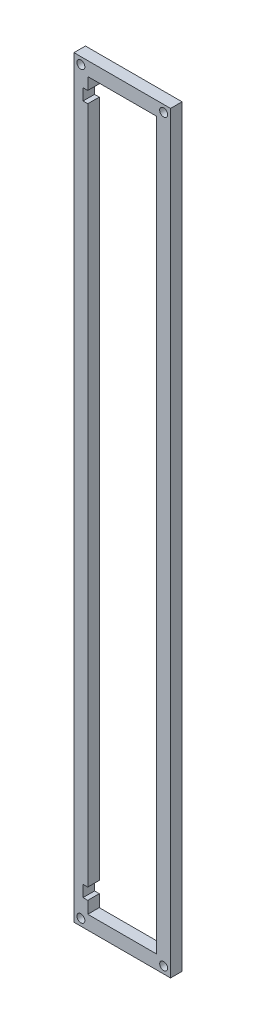
ISO-10303-21;
HEADER;
FILE_DESCRIPTION(('STEP AP214'),'2;1');
FILE_NAME('part.step','',(''),(''),'','','');
FILE_SCHEMA(('AUTOMOTIVE_DESIGN { 1 0 10303 214 1 1 1 1 }'));
ENDSEC;
DATA;
#1=APPLICATION_CONTEXT('core data for automotive mechanical design processes');
#2=APPLICATION_PROTOCOL_DEFINITION('international standard','automotive_design',2000,#1);
#3=PRODUCT_CONTEXT('',#1,'mechanical');
#4=PRODUCT('Part','Part','',(#3));
#5=PRODUCT_RELATED_PRODUCT_CATEGORY('part','',(#4));
#6=PRODUCT_DEFINITION_FORMATION('','',#4);
#7=PRODUCT_DEFINITION_CONTEXT('part definition',#1,'design');
#8=PRODUCT_DEFINITION('design','',#6,#7);
#9=PRODUCT_DEFINITION_SHAPE('','',#8);
#10=(LENGTH_UNIT() NAMED_UNIT(*) SI_UNIT(.MILLI.,.METRE.));
#11=(NAMED_UNIT(*) PLANE_ANGLE_UNIT() SI_UNIT($,.RADIAN.));
#12=(NAMED_UNIT(*) SI_UNIT($,.STERADIAN.) SOLID_ANGLE_UNIT());
#13=UNCERTAINTY_MEASURE_WITH_UNIT(LENGTH_MEASURE(1.E-05),#10,'distance_accuracy_value','');
#14=(GEOMETRIC_REPRESENTATION_CONTEXT(3) GLOBAL_UNCERTAINTY_ASSIGNED_CONTEXT((#13)) GLOBAL_UNIT_ASSIGNED_CONTEXT((#10,
#11,#12)) REPRESENTATION_CONTEXT('',''));
#15=CARTESIAN_POINT('',(0.,0.,0.));
#16=DIRECTION('',(0.,0.,1.));
#17=DIRECTION('',(1.,0.,0.));
#18=AXIS2_PLACEMENT_3D('',#15,#16,#17);
#19=CARTESIAN_POINT('',(-167.281422107139,404.74408839779,6.35));
#20=DIRECTION('',(-1.,0.,0.));
#21=DIRECTION('',(0.,0.,1.));
#22=AXIS2_PLACEMENT_3D('',#19,#20,#21);
#23=PLANE('',#22);
#24=DIRECTION('',(0.,1.,0.));
#25=VECTOR('',#24,1.);
#26=CARTESIAN_POINT('',(-167.281422107139,404.74408839779,6.35));
#27=LINE('',#26,#25);
#28=CARTESIAN_POINT('',(-167.281422107139,17.0765883977901,6.35));
#29=VERTEX_POINT('',#28);
#30=CARTESIAN_POINT('',(-167.281422107139,391.72658839779,6.35));
#31=VERTEX_POINT('',#30);
#32=EDGE_CURVE('E57',#29,#31,#27,.T.);
#33=ORIENTED_EDGE('',*,*,#32,.F.);
#34=DIRECTION('',(0.,0.,1.));
#35=VECTOR('',#34,1.);
#36=CARTESIAN_POINT('',(-167.281422107139,17.0765883977901,0.));
#37=LINE('',#36,#35);
#38=CARTESIAN_POINT('',(-167.281422107139,17.0765883977901,0.));
#39=VERTEX_POINT('',#38);
#40=EDGE_CURVE('E176',#39,#29,#37,.T.);
#41=ORIENTED_EDGE('',*,*,#40,.F.);
#42=DIRECTION('',(0.,1.,0.));
#43=VECTOR('',#42,1.);
#44=CARTESIAN_POINT('',(-167.281422107139,404.74408839779,0.));
#45=LINE('',#44,#43);
#46=CARTESIAN_POINT('',(-167.281422107139,391.72658839779,0.));
#47=VERTEX_POINT('',#46);
#48=EDGE_CURVE('E251',#39,#47,#45,.T.);
#49=ORIENTED_EDGE('',*,*,#48,.T.);
#50=DIRECTION('',(0.,0.,1.));
#51=VECTOR('',#50,1.);
#52=CARTESIAN_POINT('',(-167.281422107139,391.72658839779,0.));
#53=LINE('',#52,#51);
#54=EDGE_CURVE('E199',#47,#31,#53,.T.);
#55=ORIENTED_EDGE('',*,*,#54,.T.);
#56=EDGE_LOOP('',(#33,#41,#49,#55));
#57=FACE_BOUND('',#56,.T.);
#58=ADVANCED_FACE('F34',(#57),#23,.F.);
#59=CARTESIAN_POINT('',(-167.281422107139,398.07658839779,6.35));
#60=VERTEX_POINT('',#59);
#61=CARTESIAN_POINT('',(-167.281422107139,404.74408839779,6.35));
#62=VERTEX_POINT('',#61);
#63=EDGE_CURVE('E238',#60,#62,#27,.T.);
#64=ORIENTED_EDGE('',*,*,#63,.F.);
#65=DIRECTION('',(0.,0.,1.));
#66=VECTOR('',#65,1.);
#67=CARTESIAN_POINT('',(-167.281422107139,398.07658839779,0.));
#68=LINE('',#67,#66);
#69=CARTESIAN_POINT('',(-167.281422107139,398.07658839779,0.));
#70=VERTEX_POINT('',#69);
#71=EDGE_CURVE('E197',#70,#60,#68,.T.);
#72=ORIENTED_EDGE('',*,*,#71,.F.);
#73=CARTESIAN_POINT('',(-167.281422107139,404.74408839779,0.));
#74=VERTEX_POINT('',#73);
#75=EDGE_CURVE('E233',#70,#74,#45,.T.);
#76=ORIENTED_EDGE('',*,*,#75,.T.);
#77=DIRECTION('',(0.,0.,-1.));
#78=VECTOR('',#77,1.);
#79=CARTESIAN_POINT('',(-167.281422107139,404.74408839779,6.35));
#80=LINE('',#79,#78);
#81=EDGE_CURVE('E247',#62,#74,#80,.T.);
#82=ORIENTED_EDGE('',*,*,#81,.F.);
#83=EDGE_LOOP('',(#64,#72,#76,#82));
#84=FACE_BOUND('',#83,.T.);
#85=ADVANCED_FACE('F317',(#84),#23,.F.);
#86=CARTESIAN_POINT('',(-121.561422107139,412.36408839779,6.35));
#87=DIRECTION('',(-1.,0.,0.));
#88=DIRECTION('',(0.,-1.,0.));
#89=AXIS2_PLACEMENT_3D('',#86,#87,#88);
#90=PLANE('',#89);
#91=DIRECTION('',(0.,1.,0.));
#92=VECTOR('',#91,1.);
#93=CARTESIAN_POINT('',(-121.561422107139,412.36408839779,0.));
#94=LINE('',#93,#92);
#95=CARTESIAN_POINT('',(-121.561422107139,-3.56091160220995,0.));
#96=VERTEX_POINT('',#95);
#97=CARTESIAN_POINT('',(-121.561422107139,412.36408839779,0.));
#98=VERTEX_POINT('',#97);
#99=EDGE_CURVE('E262',#96,#98,#94,.T.);
#100=ORIENTED_EDGE('',*,*,#99,.T.);
#101=DIRECTION('',(0.,0.,-1.));
#102=VECTOR('',#101,1.);
#103=CARTESIAN_POINT('',(-121.561422107139,412.36408839779,6.35));
#104=LINE('',#103,#102);
#105=CARTESIAN_POINT('',(-121.561422107139,412.36408839779,6.35));
#106=VERTEX_POINT('',#105);
#107=EDGE_CURVE('E11',#106,#98,#104,.T.);
#108=ORIENTED_EDGE('',*,*,#107,.F.);
#109=DIRECTION('',(0.,1.,0.));
#110=VECTOR('',#109,1.);
#111=CARTESIAN_POINT('',(-121.561422107139,412.36408839779,6.35));
#112=LINE('',#111,#110);
#113=CARTESIAN_POINT('',(-121.561422107139,-3.56091160220995,6.35));
#114=VERTEX_POINT('',#113);
#115=EDGE_CURVE('E269',#114,#106,#112,.T.);
#116=ORIENTED_EDGE('',*,*,#115,.F.);
#117=DIRECTION('',(0.,0.,-1.));
#118=VECTOR('',#117,1.);
#119=CARTESIAN_POINT('',(-121.561422107139,-3.56091160220995,6.35));
#120=LINE('',#119,#118);
#121=EDGE_CURVE('E279',#114,#96,#120,.T.);
#122=ORIENTED_EDGE('',*,*,#121,.T.);
#123=EDGE_LOOP('',(#100,#108,#116,#122));
#124=FACE_BOUND('',#123,.T.);
#125=ADVANCED_FACE('F36',(#124),#90,.F.);
#126=CARTESIAN_POINT('',(-174.901422107139,412.36408839779,6.35));
#127=DIRECTION('',(0.,-1.,0.));
#128=DIRECTION('',(0.,0.,-1.));
#129=AXIS2_PLACEMENT_3D('',#126,#127,#128);
#130=PLANE('',#129);
#131=DIRECTION('',(-1.,0.,0.));
#132=VECTOR('',#131,1.);
#133=CARTESIAN_POINT('',(-174.901422107139,412.36408839779,0.));
#134=LINE('',#133,#132);
#135=CARTESIAN_POINT('',(-174.901422107139,412.36408839779,0.));
#136=VERTEX_POINT('',#135);
#137=EDGE_CURVE('E282',#98,#136,#134,.T.);
#138=ORIENTED_EDGE('',*,*,#137,.T.);
#139=DIRECTION('',(0.,0.,-1.));
#140=VECTOR('',#139,1.);
#141=CARTESIAN_POINT('',(-174.901422107139,412.36408839779,6.35));
#142=LINE('',#141,#140);
#143=CARTESIAN_POINT('',(-174.901422107139,412.36408839779,6.35));
#144=VERTEX_POINT('',#143);
#145=EDGE_CURVE('E42',#144,#136,#142,.T.);
#146=ORIENTED_EDGE('',*,*,#145,.F.);
#147=DIRECTION('',(-1.,0.,0.));
#148=VECTOR('',#147,1.);
#149=CARTESIAN_POINT('',(-174.901422107139,412.36408839779,6.35));
#150=LINE('',#149,#148);
#151=EDGE_CURVE('E272',#106,#144,#150,.T.);
#152=ORIENTED_EDGE('',*,*,#151,.F.);
#153=ORIENTED_EDGE('',*,*,#107,.T.);
#154=EDGE_LOOP('',(#138,#146,#152,#153));
#155=FACE_BOUND('',#154,.T.);
#156=ADVANCED_FACE('F310',(#155),#130,.F.);
#157=CARTESIAN_POINT('',(-174.901422107139,412.36408839779,6.35));
#158=DIRECTION('',(1.,0.,0.));
#159=DIRECTION('',(0.,1.,0.));
#160=AXIS2_PLACEMENT_3D('',#157,#158,#159);
#161=PLANE('',#160);
#162=DIRECTION('',(0.,-1.,0.));
#163=VECTOR('',#162,1.);
#164=CARTESIAN_POINT('',(-174.901422107139,412.36408839779,0.));
#165=LINE('',#164,#163);
#166=CARTESIAN_POINT('',(-174.901422107139,-3.56091160220995,0.));
#167=VERTEX_POINT('',#166);
#168=EDGE_CURVE('E284',#136,#167,#165,.T.);
#169=ORIENTED_EDGE('',*,*,#168,.T.);
#170=DIRECTION('',(0.,0.,-1.));
#171=VECTOR('',#170,1.);
#172=CARTESIAN_POINT('',(-174.901422107139,-3.56091160220995,6.35));
#173=LINE('',#172,#171);
#174=CARTESIAN_POINT('',(-174.901422107139,-3.56091160220995,6.35));
#175=VERTEX_POINT('',#174);
#176=EDGE_CURVE('E289',#175,#167,#173,.T.);
#177=ORIENTED_EDGE('',*,*,#176,.F.);
#178=DIRECTION('',(0.,-1.,0.));
#179=VECTOR('',#178,1.);
#180=CARTESIAN_POINT('',(-174.901422107139,412.36408839779,6.35));
#181=LINE('',#180,#179);
#182=EDGE_CURVE('E275',#144,#175,#181,.T.);
#183=ORIENTED_EDGE('',*,*,#182,.F.);
#184=ORIENTED_EDGE('',*,*,#145,.T.);
#185=EDGE_LOOP('',(#169,#177,#183,#184));
#186=FACE_BOUND('',#185,.T.);
#187=ADVANCED_FACE('F296',(#186),#161,.F.);
#188=CARTESIAN_POINT('',(-174.901422107139,-3.56091160220995,6.35));
#189=DIRECTION('',(0.,1.,0.));
#190=DIRECTION('',(0.,0.,1.));
#191=AXIS2_PLACEMENT_3D('',#188,#189,#190);
#192=PLANE('',#191);
#193=DIRECTION('',(1.,0.,0.));
#194=VECTOR('',#193,1.);
#195=CARTESIAN_POINT('',(-174.901422107139,-3.56091160220995,0.));
#196=LINE('',#195,#194);
#197=EDGE_CURVE('E273',#167,#96,#196,.T.);
#198=ORIENTED_EDGE('',*,*,#197,.T.);
#199=ORIENTED_EDGE('',*,*,#121,.F.);
#200=DIRECTION('',(1.,0.,0.));
#201=VECTOR('',#200,1.);
#202=CARTESIAN_POINT('',(-174.901422107139,-3.56091160220995,6.35));
#203=LINE('',#202,#201);
#204=EDGE_CURVE('E277',#175,#114,#203,.T.);
#205=ORIENTED_EDGE('',*,*,#204,.F.);
#206=ORIENTED_EDGE('',*,*,#176,.T.);
#207=EDGE_LOOP('',(#198,#199,#205,#206));
#208=FACE_BOUND('',#207,.T.);
#209=ADVANCED_FACE('F303',(#208),#192,.F.);
#210=CARTESIAN_POINT('',(0.,0.,6.35));
#211=DIRECTION('',(0.,0.,1.));
#212=DIRECTION('',(1.,0.,0.));
#213=AXIS2_PLACEMENT_3D('',#210,#211,#212);
#214=PLANE('',#213);
#215=DIRECTION('',(-1.,0.,0.));
#216=VECTOR('',#215,1.);
#217=CARTESIAN_POINT('',(0.,17.0765883977901,6.35));
#218=LINE('',#217,#216);
#219=CARTESIAN_POINT('',(-169.900797107139,17.0765883977901,6.35));
#220=VERTEX_POINT('',#219);
#221=EDGE_CURVE('E180',#29,#220,#218,.T.);
#222=ORIENTED_EDGE('',*,*,#221,.F.);
#223=ORIENTED_EDGE('',*,*,#32,.T.);
#224=DIRECTION('',(1.,0.,0.));
#225=VECTOR('',#224,1.);
#226=CARTESIAN_POINT('',(0.,391.72658839779,6.35));
#227=LINE('',#226,#225);
#228=CARTESIAN_POINT('',(-169.900797107136,391.72658839779,6.35));
#229=VERTEX_POINT('',#228);
#230=EDGE_CURVE('E196',#229,#31,#227,.T.);
#231=ORIENTED_EDGE('',*,*,#230,.F.);
#232=DIRECTION('',(0.,-1.,0.));
#233=VECTOR('',#232,1.);
#234=CARTESIAN_POINT('',(-169.900797107136,0.,6.35));
#235=LINE('',#234,#233);
#236=CARTESIAN_POINT('',(-169.900797107136,398.07658839779,6.35));
#237=VERTEX_POINT('',#236);
#238=EDGE_CURVE('E207',#237,#229,#235,.T.);
#239=ORIENTED_EDGE('',*,*,#238,.F.);
#240=DIRECTION('',(-1.,0.,0.));
#241=VECTOR('',#240,1.);
#242=CARTESIAN_POINT('',(0.,398.07658839779,6.35));
#243=LINE('',#242,#241);
#244=EDGE_CURVE('E205',#60,#237,#243,.T.);
#245=ORIENTED_EDGE('',*,*,#244,.F.);
#246=ORIENTED_EDGE('',*,*,#63,.T.);
#247=DIRECTION('',(1.,0.,0.));
#248=VECTOR('',#247,1.);
#249=CARTESIAN_POINT('',(-129.181422107139,404.74408839779,6.35));
#250=LINE('',#249,#248);
#251=CARTESIAN_POINT('',(-129.181422107139,404.74408839779,6.35));
#252=VERTEX_POINT('',#251);
#253=EDGE_CURVE('E237',#62,#252,#250,.T.);
#254=ORIENTED_EDGE('',*,*,#253,.T.);
#255=DIRECTION('',(0.,-1.,0.));
#256=VECTOR('',#255,1.);
#257=CARTESIAN_POINT('',(-129.181422107139,404.74408839779,6.35));
#258=LINE('',#257,#256);
#259=CARTESIAN_POINT('',(-129.181422107139,4.05908839779005,6.35));
#260=VERTEX_POINT('',#259);
#261=EDGE_CURVE('E241',#252,#260,#258,.T.);
#262=ORIENTED_EDGE('',*,*,#261,.T.);
#263=DIRECTION('',(-1.,0.,0.));
#264=VECTOR('',#263,1.);
#265=CARTESIAN_POINT('',(-129.181422107139,4.05908839779005,6.35));
#266=LINE('',#265,#264);
#267=CARTESIAN_POINT('',(-167.281422107139,4.05908839779005,6.35));
#268=VERTEX_POINT('',#267);
#269=EDGE_CURVE('E244',#260,#268,#266,.T.);
#270=ORIENTED_EDGE('',*,*,#269,.T.);
#271=CARTESIAN_POINT('',(-167.281422107139,10.7265883977902,6.35));
#272=VERTEX_POINT('',#271);
#273=EDGE_CURVE('E234',#268,#272,#27,.T.);
#274=ORIENTED_EDGE('',*,*,#273,.T.);
#275=DIRECTION('',(1.,0.,0.));
#276=VECTOR('',#275,1.);
#277=CARTESIAN_POINT('',(0.,10.7265883977901,6.35));
#278=LINE('',#277,#276);
#279=CARTESIAN_POINT('',(-169.900797107139,10.7265883977901,6.35));
#280=VERTEX_POINT('',#279);
#281=EDGE_CURVE('E49',#280,#272,#278,.T.);
#282=ORIENTED_EDGE('',*,*,#281,.F.);
#283=DIRECTION('',(0.,-1.,0.));
#284=VECTOR('',#283,1.);
#285=CARTESIAN_POINT('',(-169.900797107139,0.,6.35));
#286=LINE('',#285,#284);
#287=EDGE_CURVE('E157',#220,#280,#286,.T.);
#288=ORIENTED_EDGE('',*,*,#287,.F.);
#289=EDGE_LOOP('',(#222,#223,#231,#239,#245,#246,#254,#262,#270,#274,#282,#288));
#290=FACE_BOUND('',#289,.T.);
#291=CARTESIAN_POINT('',(-171.091422107139,0.249088397790042,6.35));
#292=DIRECTION('',(0.,0.,-1.));
#293=DIRECTION('',(-1.,0.,0.));
#294=AXIS2_PLACEMENT_3D('',#291,#292,#293);
#295=CIRCLE('',#294,2.19710000000001);
#296=CARTESIAN_POINT('',(-173.288522107139,0.249088397790042,6.35));
#297=VERTEX_POINT('',#296);
#298=EDGE_CURVE('E212',#297,#297,#295,.T.);
#299=ORIENTED_EDGE('',*,*,#298,.T.);
#300=EDGE_LOOP('',(#299));
#301=FACE_BOUND('',#300,.T.);
#302=CARTESIAN_POINT('',(-125.371422107139,408.55408839779,6.35));
#303=DIRECTION('',(0.,0.,-1.));
#304=DIRECTION('',(-1.,0.,0.));
#305=AXIS2_PLACEMENT_3D('',#302,#303,#304);
#306=CIRCLE('',#305,2.19709999999999);
#307=CARTESIAN_POINT('',(-127.568522107139,408.55408839779,6.35));
#308=VERTEX_POINT('',#307);
#309=EDGE_CURVE('E218',#308,#308,#306,.T.);
#310=ORIENTED_EDGE('',*,*,#309,.T.);
#311=EDGE_LOOP('',(#310));
#312=FACE_BOUND('',#311,.T.);
#313=CARTESIAN_POINT('',(-125.371422107139,0.24908839779008,6.35));
#314=DIRECTION('',(0.,0.,-1.));
#315=DIRECTION('',(-1.,0.,0.));
#316=AXIS2_PLACEMENT_3D('',#313,#314,#315);
#317=CIRCLE('',#316,2.19709999999999);
#318=CARTESIAN_POINT('',(-127.568522107139,0.24908839779008,6.35));
#319=VERTEX_POINT('',#318);
#320=EDGE_CURVE('E224',#319,#319,#317,.T.);
#321=ORIENTED_EDGE('',*,*,#320,.T.);
#322=EDGE_LOOP('',(#321));
#323=FACE_BOUND('',#322,.T.);
#324=CARTESIAN_POINT('',(-171.091422107139,408.55408839779,6.35));
#325=DIRECTION('',(0.,0.,-1.));
#326=DIRECTION('',(-1.,0.,0.));
#327=AXIS2_PLACEMENT_3D('',#324,#325,#326);
#328=CIRCLE('',#327,2.19710000000001);
#329=CARTESIAN_POINT('',(-173.288522107139,408.55408839779,6.35));
#330=VERTEX_POINT('',#329);
#331=EDGE_CURVE('E230',#330,#330,#328,.T.);
#332=ORIENTED_EDGE('',*,*,#331,.T.);
#333=EDGE_LOOP('',(#332));
#334=FACE_BOUND('',#333,.T.);
#335=ORIENTED_EDGE('',*,*,#115,.T.);
#336=ORIENTED_EDGE('',*,*,#151,.T.);
#337=ORIENTED_EDGE('',*,*,#182,.T.);
#338=ORIENTED_EDGE('',*,*,#204,.T.);
#339=EDGE_LOOP('',(#335,#336,#337,#338));
#340=FACE_BOUND('',#339,.T.);
#341=ADVANCED_FACE('F309',(#290,#301,#312,#323,#334,#340),#214,.T.);
#342=CARTESIAN_POINT('',(0.,0.,0.));
#343=DIRECTION('',(0.,0.,1.));
#344=DIRECTION('',(1.,0.,0.));
#345=AXIS2_PLACEMENT_3D('',#342,#343,#344);
#346=PLANE('',#345);
#347=CARTESIAN_POINT('',(-171.091422107139,0.249088397790042,0.));
#348=DIRECTION('',(0.,0.,-1.));
#349=DIRECTION('',(-1.,0.,0.));
#350=AXIS2_PLACEMENT_3D('',#347,#348,#349);
#351=CIRCLE('',#350,2.19710000000001);
#352=CARTESIAN_POINT('',(-173.288522107139,0.249088397790042,0.));
#353=VERTEX_POINT('',#352);
#354=EDGE_CURVE('E209',#353,#353,#351,.T.);
#355=ORIENTED_EDGE('',*,*,#354,.F.);
#356=EDGE_LOOP('',(#355));
#357=FACE_BOUND('',#356,.T.);
#358=CARTESIAN_POINT('',(-125.371422107139,408.55408839779,0.));
#359=DIRECTION('',(0.,0.,-1.));
#360=DIRECTION('',(-1.,0.,0.));
#361=AXIS2_PLACEMENT_3D('',#358,#359,#360);
#362=CIRCLE('',#361,2.19709999999999);
#363=CARTESIAN_POINT('',(-127.568522107139,408.55408839779,0.));
#364=VERTEX_POINT('',#363);
#365=EDGE_CURVE('E215',#364,#364,#362,.T.);
#366=ORIENTED_EDGE('',*,*,#365,.F.);
#367=EDGE_LOOP('',(#366));
#368=FACE_BOUND('',#367,.T.);
#369=CARTESIAN_POINT('',(-125.371422107139,0.24908839779008,0.));
#370=DIRECTION('',(0.,0.,-1.));
#371=DIRECTION('',(-1.,0.,0.));
#372=AXIS2_PLACEMENT_3D('',#369,#370,#371);
#373=CIRCLE('',#372,2.19709999999999);
#374=CARTESIAN_POINT('',(-127.568522107139,0.24908839779008,0.));
#375=VERTEX_POINT('',#374);
#376=EDGE_CURVE('E221',#375,#375,#373,.T.);
#377=ORIENTED_EDGE('',*,*,#376,.F.);
#378=EDGE_LOOP('',(#377));
#379=FACE_BOUND('',#378,.T.);
#380=CARTESIAN_POINT('',(-171.091422107139,408.55408839779,0.));
#381=DIRECTION('',(0.,0.,-1.));
#382=DIRECTION('',(-1.,0.,0.));
#383=AXIS2_PLACEMENT_3D('',#380,#381,#382);
#384=CIRCLE('',#383,2.19710000000001);
#385=CARTESIAN_POINT('',(-173.288522107139,408.55408839779,0.));
#386=VERTEX_POINT('',#385);
#387=EDGE_CURVE('E227',#386,#386,#384,.T.);
#388=ORIENTED_EDGE('',*,*,#387,.F.);
#389=EDGE_LOOP('',(#388));
#390=FACE_BOUND('',#389,.T.);
#391=ORIENTED_EDGE('',*,*,#48,.F.);
#392=DIRECTION('',(-1.,0.,0.));
#393=VECTOR('',#392,1.);
#394=CARTESIAN_POINT('',(-169.900797107139,17.0765883977901,0.));
#395=LINE('',#394,#393);
#396=CARTESIAN_POINT('',(-169.900797107139,17.0765883977901,0.));
#397=VERTEX_POINT('',#396);
#398=EDGE_CURVE('E159',#39,#397,#395,.T.);
#399=ORIENTED_EDGE('',*,*,#398,.T.);
#400=DIRECTION('',(0.,-1.,0.));
#401=VECTOR('',#400,1.);
#402=CARTESIAN_POINT('',(-169.900797107139,10.7265883977901,0.));
#403=LINE('',#402,#401);
#404=CARTESIAN_POINT('',(-169.900797107139,10.7265883977901,0.));
#405=VERTEX_POINT('',#404);
#406=EDGE_CURVE('E154',#397,#405,#403,.T.);
#407=ORIENTED_EDGE('',*,*,#406,.T.);
#408=DIRECTION('',(1.,0.,0.));
#409=VECTOR('',#408,1.);
#410=CARTESIAN_POINT('',(-169.900797107139,10.7265883977901,0.));
#411=LINE('',#410,#409);
#412=CARTESIAN_POINT('',(-167.281422107139,10.7265883977901,0.));
#413=VERTEX_POINT('',#412);
#414=EDGE_CURVE('E162',#405,#413,#411,.T.);
#415=ORIENTED_EDGE('',*,*,#414,.T.);
#416=CARTESIAN_POINT('',(-167.281422107139,4.05908839779005,0.));
#417=VERTEX_POINT('',#416);
#418=EDGE_CURVE('E248',#417,#413,#45,.T.);
#419=ORIENTED_EDGE('',*,*,#418,.F.);
#420=DIRECTION('',(-1.,0.,0.));
#421=VECTOR('',#420,1.);
#422=CARTESIAN_POINT('',(-129.181422107139,4.05908839779005,0.));
#423=LINE('',#422,#421);
#424=CARTESIAN_POINT('',(-129.181422107139,4.05908839779005,0.));
#425=VERTEX_POINT('',#424);
#426=EDGE_CURVE('E257',#425,#417,#423,.T.);
#427=ORIENTED_EDGE('',*,*,#426,.F.);
#428=DIRECTION('',(0.,-1.,0.));
#429=VECTOR('',#428,1.);
#430=CARTESIAN_POINT('',(-129.181422107139,404.74408839779,0.));
#431=LINE('',#430,#429);
#432=CARTESIAN_POINT('',(-129.181422107139,404.74408839779,0.));
#433=VERTEX_POINT('',#432);
#434=EDGE_CURVE('E254',#433,#425,#431,.T.);
#435=ORIENTED_EDGE('',*,*,#434,.F.);
#436=DIRECTION('',(1.,0.,0.));
#437=VECTOR('',#436,1.);
#438=CARTESIAN_POINT('',(-129.181422107139,404.74408839779,0.));
#439=LINE('',#438,#437);
#440=EDGE_CURVE('E250',#74,#433,#439,.T.);
#441=ORIENTED_EDGE('',*,*,#440,.F.);
#442=ORIENTED_EDGE('',*,*,#75,.F.);
#443=DIRECTION('',(-1.,0.,0.));
#444=VECTOR('',#443,1.);
#445=CARTESIAN_POINT('',(-169.900797107136,398.07658839779,0.));
#446=LINE('',#445,#444);
#447=CARTESIAN_POINT('',(-169.900797107136,398.07658839779,0.));
#448=VERTEX_POINT('',#447);
#449=EDGE_CURVE('E189',#70,#448,#446,.T.);
#450=ORIENTED_EDGE('',*,*,#449,.T.);
#451=DIRECTION('',(0.,-1.,0.));
#452=VECTOR('',#451,1.);
#453=CARTESIAN_POINT('',(-169.900797107136,391.72658839779,0.));
#454=LINE('',#453,#452);
#455=CARTESIAN_POINT('',(-169.900797107136,391.72658839779,0.));
#456=VERTEX_POINT('',#455);
#457=EDGE_CURVE('E183',#448,#456,#454,.T.);
#458=ORIENTED_EDGE('',*,*,#457,.T.);
#459=DIRECTION('',(1.,0.,0.));
#460=VECTOR('',#459,1.);
#461=CARTESIAN_POINT('',(-169.900797107136,391.72658839779,0.));
#462=LINE('',#461,#460);
#463=EDGE_CURVE('E186',#456,#47,#462,.T.);
#464=ORIENTED_EDGE('',*,*,#463,.T.);
#465=EDGE_LOOP('',(#391,#399,#407,#415,#419,#427,#435,#441,#442,#450,#458,#464));
#466=FACE_BOUND('',#465,.T.);
#467=ORIENTED_EDGE('',*,*,#99,.F.);
#468=ORIENTED_EDGE('',*,*,#197,.F.);
#469=ORIENTED_EDGE('',*,*,#168,.F.);
#470=ORIENTED_EDGE('',*,*,#137,.F.);
#471=EDGE_LOOP('',(#467,#468,#469,#470));
#472=FACE_BOUND('',#471,.T.);
#473=ADVANCED_FACE('F169',(#357,#368,#379,#390,#466,#472),#346,.F.);
#474=ORIENTED_EDGE('',*,*,#418,.T.);
#475=DIRECTION('',(0.,0.,1.));
#476=VECTOR('',#475,1.);
#477=CARTESIAN_POINT('',(-167.281422107139,10.7265883977901,0.));
#478=LINE('',#477,#476);
#479=EDGE_CURVE('E158',#413,#272,#478,.T.);
#480=ORIENTED_EDGE('',*,*,#479,.T.);
#481=ORIENTED_EDGE('',*,*,#273,.F.);
#482=DIRECTION('',(0.,0.,-1.));
#483=VECTOR('',#482,1.);
#484=CARTESIAN_POINT('',(-167.281422107139,4.05908839779005,6.35));
#485=LINE('',#484,#483);
#486=EDGE_CURVE('E260',#268,#417,#485,.T.);
#487=ORIENTED_EDGE('',*,*,#486,.T.);
#488=EDGE_LOOP('',(#474,#480,#481,#487));
#489=FACE_BOUND('',#488,.T.);
#490=ADVANCED_FACE('F321',(#489),#23,.F.);
#491=CARTESIAN_POINT('',(-129.181422107139,4.05908839779005,6.35));
#492=DIRECTION('',(0.,-1.,0.));
#493=DIRECTION('',(0.,0.,-1.));
#494=AXIS2_PLACEMENT_3D('',#491,#492,#493);
#495=PLANE('',#494);
#496=ORIENTED_EDGE('',*,*,#426,.T.);
#497=ORIENTED_EDGE('',*,*,#486,.F.);
#498=ORIENTED_EDGE('',*,*,#269,.F.);
#499=DIRECTION('',(0.,0.,-1.));
#500=VECTOR('',#499,1.);
#501=CARTESIAN_POINT('',(-129.181422107139,4.05908839779005,6.35));
#502=LINE('',#501,#500);
#503=EDGE_CURVE('E263',#260,#425,#502,.T.);
#504=ORIENTED_EDGE('',*,*,#503,.T.);
#505=EDGE_LOOP('',(#496,#497,#498,#504));
#506=FACE_BOUND('',#505,.T.);
#507=ADVANCED_FACE('F329',(#506),#495,.F.);
#508=CARTESIAN_POINT('',(-129.181422107139,404.74408839779,6.35));
#509=DIRECTION('',(1.,0.,0.));
#510=DIRECTION('',(0.,0.,-1.));
#511=AXIS2_PLACEMENT_3D('',#508,#509,#510);
#512=PLANE('',#511);
#513=ORIENTED_EDGE('',*,*,#434,.T.);
#514=ORIENTED_EDGE('',*,*,#503,.F.);
#515=ORIENTED_EDGE('',*,*,#261,.F.);
#516=DIRECTION('',(0.,0.,-1.));
#517=VECTOR('',#516,1.);
#518=CARTESIAN_POINT('',(-129.181422107139,404.74408839779,6.35));
#519=LINE('',#518,#517);
#520=EDGE_CURVE('E265',#252,#433,#519,.T.);
#521=ORIENTED_EDGE('',*,*,#520,.T.);
#522=EDGE_LOOP('',(#513,#514,#515,#521));
#523=FACE_BOUND('',#522,.T.);
#524=ADVANCED_FACE('F335',(#523),#512,.F.);
#525=CARTESIAN_POINT('',(-129.181422107139,404.74408839779,6.35));
#526=DIRECTION('',(0.,1.,0.));
#527=DIRECTION('',(0.,0.,1.));
#528=AXIS2_PLACEMENT_3D('',#525,#526,#527);
#529=PLANE('',#528);
#530=ORIENTED_EDGE('',*,*,#440,.T.);
#531=ORIENTED_EDGE('',*,*,#520,.F.);
#532=ORIENTED_EDGE('',*,*,#253,.F.);
#533=ORIENTED_EDGE('',*,*,#81,.T.);
#534=EDGE_LOOP('',(#530,#531,#532,#533));
#535=FACE_BOUND('',#534,.T.);
#536=ADVANCED_FACE('F349',(#535),#529,.F.);
#537=CARTESIAN_POINT('',(-171.091422107139,408.55408839779,0.));
#538=DIRECTION('',(0.,0.,-1.));
#539=DIRECTION('',(-1.,0.,0.));
#540=AXIS2_PLACEMENT_3D('',#537,#538,#539);
#541=CYLINDRICAL_SURFACE('',#540,2.19710000000001);
#542=ORIENTED_EDGE('',*,*,#331,.F.);
#543=EDGE_LOOP('',(#542));
#544=FACE_BOUND('',#543,.T.);
#545=ORIENTED_EDGE('',*,*,#387,.T.);
#546=EDGE_LOOP('',(#545));
#547=FACE_BOUND('',#546,.T.);
#548=ADVANCED_FACE('F395',(#544,#547),#541,.F.);
#549=CARTESIAN_POINT('',(-125.371422107139,0.24908839779008,0.));
#550=DIRECTION('',(0.,0.,-1.));
#551=DIRECTION('',(-1.,0.,0.));
#552=AXIS2_PLACEMENT_3D('',#549,#550,#551);
#553=CYLINDRICAL_SURFACE('',#552,2.19709999999999);
#554=ORIENTED_EDGE('',*,*,#320,.F.);
#555=EDGE_LOOP('',(#554));
#556=FACE_BOUND('',#555,.T.);
#557=ORIENTED_EDGE('',*,*,#376,.T.);
#558=EDGE_LOOP('',(#557));
#559=FACE_BOUND('',#558,.T.);
#560=ADVANCED_FACE('F391',(#556,#559),#553,.F.);
#561=CARTESIAN_POINT('',(-125.371422107139,408.55408839779,0.));
#562=DIRECTION('',(0.,0.,-1.));
#563=DIRECTION('',(-1.,0.,0.));
#564=AXIS2_PLACEMENT_3D('',#561,#562,#563);
#565=CYLINDRICAL_SURFACE('',#564,2.19709999999999);
#566=ORIENTED_EDGE('',*,*,#309,.F.);
#567=EDGE_LOOP('',(#566));
#568=FACE_BOUND('',#567,.T.);
#569=ORIENTED_EDGE('',*,*,#365,.T.);
#570=EDGE_LOOP('',(#569));
#571=FACE_BOUND('',#570,.T.);
#572=ADVANCED_FACE('F387',(#568,#571),#565,.F.);
#573=CARTESIAN_POINT('',(-171.091422107139,0.249088397790042,0.));
#574=DIRECTION('',(0.,0.,-1.));
#575=DIRECTION('',(-1.,0.,0.));
#576=AXIS2_PLACEMENT_3D('',#573,#574,#575);
#577=CYLINDRICAL_SURFACE('',#576,2.19710000000001);
#578=ORIENTED_EDGE('',*,*,#298,.F.);
#579=EDGE_LOOP('',(#578));
#580=FACE_BOUND('',#579,.T.);
#581=ORIENTED_EDGE('',*,*,#354,.T.);
#582=EDGE_LOOP('',(#581));
#583=FACE_BOUND('',#582,.T.);
#584=ADVANCED_FACE('F384',(#580,#583),#577,.F.);
#585=CARTESIAN_POINT('',(-169.900797107136,391.72658839779,0.));
#586=DIRECTION('',(-1.,0.,0.));
#587=DIRECTION('',(0.,0.,1.));
#588=AXIS2_PLACEMENT_3D('',#585,#586,#587);
#589=PLANE('',#588);
#590=ORIENTED_EDGE('',*,*,#238,.T.);
#591=DIRECTION('',(0.,0.,1.));
#592=VECTOR('',#591,1.);
#593=CARTESIAN_POINT('',(-169.900797107136,391.72658839779,0.));
#594=LINE('',#593,#592);
#595=EDGE_CURVE('E192',#456,#229,#594,.T.);
#596=ORIENTED_EDGE('',*,*,#595,.F.);
#597=ORIENTED_EDGE('',*,*,#457,.F.);
#598=DIRECTION('',(0.,0.,1.));
#599=VECTOR('',#598,1.);
#600=CARTESIAN_POINT('',(-169.900797107136,398.07658839779,0.));
#601=LINE('',#600,#599);
#602=EDGE_CURVE('E193',#448,#237,#601,.T.);
#603=ORIENTED_EDGE('',*,*,#602,.T.);
#604=EDGE_LOOP('',(#590,#596,#597,#603));
#605=FACE_BOUND('',#604,.T.);
#606=ADVANCED_FACE('F360',(#605),#589,.F.);
#607=CARTESIAN_POINT('',(-169.900797107136,398.07658839779,0.));
#608=DIRECTION('',(0.,1.,0.));
#609=DIRECTION('',(0.,0.,1.));
#610=AXIS2_PLACEMENT_3D('',#607,#608,#609);
#611=PLANE('',#610);
#612=ORIENTED_EDGE('',*,*,#244,.T.);
#613=ORIENTED_EDGE('',*,*,#602,.F.);
#614=ORIENTED_EDGE('',*,*,#449,.F.);
#615=ORIENTED_EDGE('',*,*,#71,.T.);
#616=EDGE_LOOP('',(#612,#613,#614,#615));
#617=FACE_BOUND('',#616,.T.);
#618=ADVANCED_FACE('F377',(#617),#611,.F.);
#619=CARTESIAN_POINT('',(-169.900797107136,391.72658839779,0.));
#620=DIRECTION('',(0.,-1.,0.));
#621=DIRECTION('',(0.,0.,-1.));
#622=AXIS2_PLACEMENT_3D('',#619,#620,#621);
#623=PLANE('',#622);
#624=ORIENTED_EDGE('',*,*,#230,.T.);
#625=ORIENTED_EDGE('',*,*,#54,.F.);
#626=ORIENTED_EDGE('',*,*,#463,.F.);
#627=ORIENTED_EDGE('',*,*,#595,.T.);
#628=EDGE_LOOP('',(#624,#625,#626,#627));
#629=FACE_BOUND('',#628,.T.);
#630=ADVANCED_FACE('F357',(#629),#623,.F.);
#631=CARTESIAN_POINT('',(-169.900797107139,10.7265883977901,0.));
#632=DIRECTION('',(-1.,0.,0.));
#633=DIRECTION('',(0.,0.,1.));
#634=AXIS2_PLACEMENT_3D('',#631,#632,#633);
#635=PLANE('',#634);
#636=ORIENTED_EDGE('',*,*,#287,.T.);
#637=DIRECTION('',(0.,0.,1.));
#638=VECTOR('',#637,1.);
#639=CARTESIAN_POINT('',(-169.900797107139,10.7265883977901,0.));
#640=LINE('',#639,#638);
#641=EDGE_CURVE('E149',#405,#280,#640,.T.);
#642=ORIENTED_EDGE('',*,*,#641,.F.);
#643=ORIENTED_EDGE('',*,*,#406,.F.);
#644=DIRECTION('',(0.,0.,1.));
#645=VECTOR('',#644,1.);
#646=CARTESIAN_POINT('',(-169.900797107139,17.0765883977901,0.));
#647=LINE('',#646,#645);
#648=EDGE_CURVE('E174',#397,#220,#647,.T.);
#649=ORIENTED_EDGE('',*,*,#648,.T.);
#650=EDGE_LOOP('',(#636,#642,#643,#649));
#651=FACE_BOUND('',#650,.T.);
#652=ADVANCED_FACE('F151',(#651),#635,.F.);
#653=CARTESIAN_POINT('',(-169.900797107139,17.0765883977901,0.));
#654=DIRECTION('',(0.,1.,0.));
#655=DIRECTION('',(0.,0.,1.));
#656=AXIS2_PLACEMENT_3D('',#653,#654,#655);
#657=PLANE('',#656);
#658=ORIENTED_EDGE('',*,*,#221,.T.);
#659=ORIENTED_EDGE('',*,*,#648,.F.);
#660=ORIENTED_EDGE('',*,*,#398,.F.);
#661=ORIENTED_EDGE('',*,*,#40,.T.);
#662=EDGE_LOOP('',(#658,#659,#660,#661));
#663=FACE_BOUND('',#662,.T.);
#664=ADVANCED_FACE('F367',(#663),#657,.F.);
#665=CARTESIAN_POINT('',(-169.900797107139,10.7265883977901,0.));
#666=DIRECTION('',(0.,-1.,0.));
#667=DIRECTION('',(0.,0.,-1.));
#668=AXIS2_PLACEMENT_3D('',#665,#666,#667);
#669=PLANE('',#668);
#670=ORIENTED_EDGE('',*,*,#281,.T.);
#671=ORIENTED_EDGE('',*,*,#479,.F.);
#672=ORIENTED_EDGE('',*,*,#414,.F.);
#673=ORIENTED_EDGE('',*,*,#641,.T.);
#674=EDGE_LOOP('',(#670,#671,#672,#673));
#675=FACE_BOUND('',#674,.T.);
#676=ADVANCED_FACE('F163',(#675),#669,.F.);
#677=CLOSED_SHELL('',(#58,#85,#125,#156,#187,#209,#341,#473,#490,#507,#524,#536,#548,#560,#572,
#584,#606,#618,#630,#652,#664,#676));
#678=MANIFOLD_SOLID_BREP('B2',#677);
#679=ADVANCED_BREP_SHAPE_REPRESENTATION('',(#18,#678),#14);
#680=SHAPE_DEFINITION_REPRESENTATION(#9,#679);
ENDSEC;
END-ISO-10303-21;
